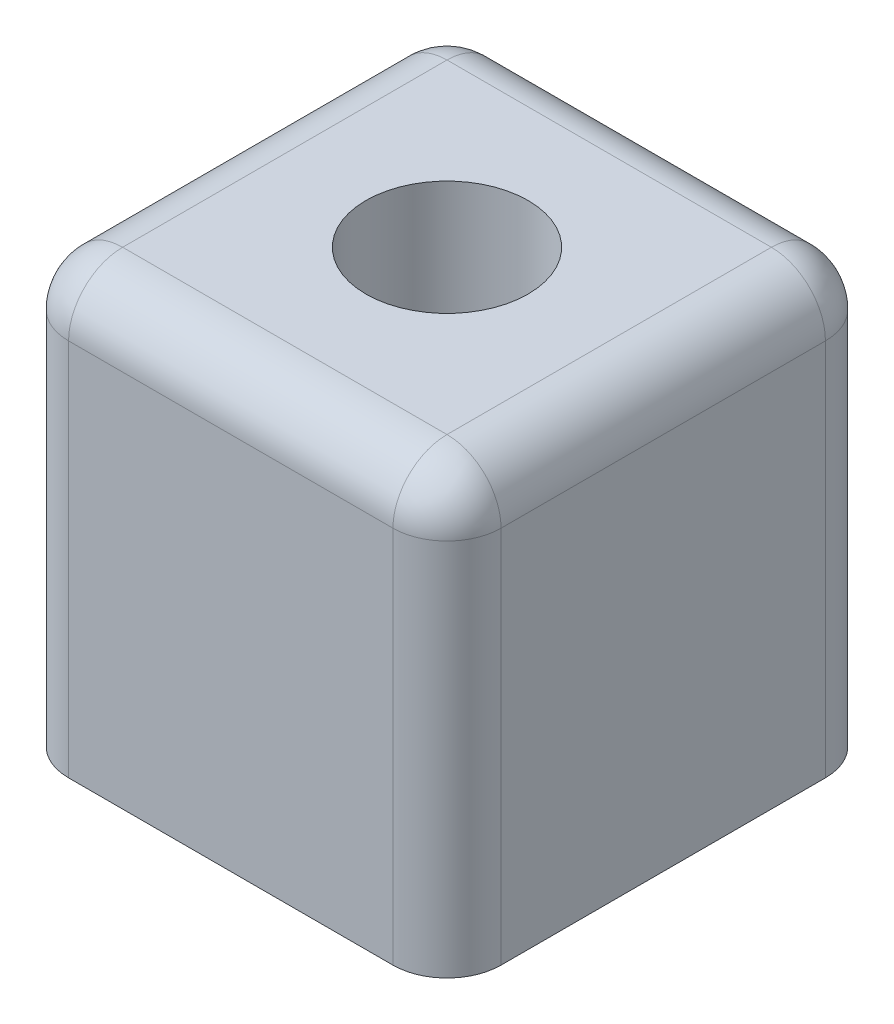
ISO-10303-21;
HEADER;
FILE_DESCRIPTION(('STEP AP214'),'2;1');
FILE_NAME('part.step','',(''),(''),'','','');
FILE_SCHEMA(('AUTOMOTIVE_DESIGN { 1 0 10303 214 1 1 1 1 }'));
ENDSEC;
DATA;
#1=APPLICATION_CONTEXT('core data for automotive mechanical design processes');
#2=APPLICATION_PROTOCOL_DEFINITION('international standard','automotive_design',2000,#1);
#3=PRODUCT_CONTEXT('',#1,'mechanical');
#4=PRODUCT('Part','Part','',(#3));
#5=PRODUCT_RELATED_PRODUCT_CATEGORY('part','',(#4));
#6=PRODUCT_DEFINITION_FORMATION('','',#4);
#7=PRODUCT_DEFINITION_CONTEXT('part definition',#1,'design');
#8=PRODUCT_DEFINITION('design','',#6,#7);
#9=PRODUCT_DEFINITION_SHAPE('','',#8);
#10=(LENGTH_UNIT() NAMED_UNIT(*) SI_UNIT(.MILLI.,.METRE.));
#11=(NAMED_UNIT(*) PLANE_ANGLE_UNIT() SI_UNIT($,.RADIAN.));
#12=(NAMED_UNIT(*) SI_UNIT($,.STERADIAN.) SOLID_ANGLE_UNIT());
#13=UNCERTAINTY_MEASURE_WITH_UNIT(LENGTH_MEASURE(1.E-05),#10,'distance_accuracy_value','');
#14=(GEOMETRIC_REPRESENTATION_CONTEXT(3) GLOBAL_UNCERTAINTY_ASSIGNED_CONTEXT((#13)) GLOBAL_UNIT_ASSIGNED_CONTEXT((#10,
#11,#12)) REPRESENTATION_CONTEXT('',''));
#15=CARTESIAN_POINT('',(0.,0.,0.));
#16=DIRECTION('',(0.,0.,1.));
#17=DIRECTION('',(1.,0.,0.));
#18=AXIS2_PLACEMENT_3D('',#15,#16,#17);
#19=CARTESIAN_POINT('',(0.,0.,80.));
#20=DIRECTION('',(1.,0.,0.));
#21=DIRECTION('',(0.,0.,-1.));
#22=AXIS2_PLACEMENT_3D('',#19,#20,#21);
#23=PLANE('',#22);
#24=DIRECTION('',(0.,0.,-1.));
#25=VECTOR('',#24,1.);
#26=CARTESIAN_POINT('',(0.,70.,80.));
#27=LINE('',#26,#25);
#28=CARTESIAN_POINT('',(0.,70.,70.));
#29=VERTEX_POINT('',#28);
#30=CARTESIAN_POINT('',(0.,70.,9.99999999999999));
#31=VERTEX_POINT('',#30);
#32=EDGE_CURVE('E309',#29,#31,#27,.T.);
#33=ORIENTED_EDGE('',*,*,#32,.T.);
#34=DIRECTION('',(0.,-1.,0.));
#35=VECTOR('',#34,1.);
#36=CARTESIAN_POINT('',(0.,0.,9.99999999999999));
#37=LINE('',#36,#35);
#38=CARTESIAN_POINT('',(0.,0.,9.99999999999999));
#39=VERTEX_POINT('',#38);
#40=EDGE_CURVE('E311',#31,#39,#37,.T.);
#41=ORIENTED_EDGE('',*,*,#40,.T.);
#42=DIRECTION('',(0.,0.,-1.));
#43=VECTOR('',#42,1.);
#44=CARTESIAN_POINT('',(0.,0.,80.));
#45=LINE('',#44,#43);
#46=CARTESIAN_POINT('',(0.,0.,70.));
#47=VERTEX_POINT('',#46);
#48=EDGE_CURVE('E282',#47,#39,#45,.T.);
#49=ORIENTED_EDGE('',*,*,#48,.F.);
#50=DIRECTION('',(0.,-1.,0.));
#51=VECTOR('',#50,1.);
#52=CARTESIAN_POINT('',(0.,0.,70.));
#53=LINE('',#52,#51);
#54=EDGE_CURVE('E307',#47,#29,#53,.F.);
#55=ORIENTED_EDGE('',*,*,#54,.T.);
#56=EDGE_LOOP('',(#33,#41,#49,#55));
#57=FACE_BOUND('',#56,.T.);
#58=ADVANCED_FACE('F37',(#57),#23,.F.);
#59=CARTESIAN_POINT('',(0.,0.,80.));
#60=DIRECTION('',(0.,1.,0.));
#61=DIRECTION('',(0.,0.,1.));
#62=AXIS2_PLACEMENT_3D('',#59,#60,#61);
#63=PLANE('',#62);
#64=DIRECTION('',(0.,0.,-1.));
#65=VECTOR('',#64,1.);
#66=CARTESIAN_POINT('',(3.,0.,80.));
#67=LINE('',#66,#65);
#68=CARTESIAN_POINT('',(3.,0.,70.));
#69=VERTEX_POINT('',#68);
#70=CARTESIAN_POINT('',(3.,0.,9.99999999999999));
#71=VERTEX_POINT('',#70);
#72=EDGE_CURVE('E196',#69,#71,#67,.T.);
#73=ORIENTED_EDGE('',*,*,#72,.F.);
#74=CARTESIAN_POINT('',(10.,0.,70.));
#75=DIRECTION('',(0.,1.,0.));
#76=DIRECTION('',(0.,0.,1.));
#77=AXIS2_PLACEMENT_3D('',#74,#75,#76);
#78=CIRCLE('',#77,7.);
#79=CARTESIAN_POINT('',(10.,0.,77.));
#80=VERTEX_POINT('',#79);
#81=EDGE_CURVE('E219',#80,#69,#78,.F.);
#82=ORIENTED_EDGE('',*,*,#81,.F.);
#83=DIRECTION('',(1.,0.,0.));
#84=VECTOR('',#83,1.);
#85=CARTESIAN_POINT('',(0.,0.,77.));
#86=LINE('',#85,#84);
#87=CARTESIAN_POINT('',(70.,0.,77.));
#88=VERTEX_POINT('',#87);
#89=EDGE_CURVE('E54',#80,#88,#86,.T.);
#90=ORIENTED_EDGE('',*,*,#89,.T.);
#91=CARTESIAN_POINT('',(70.,0.,70.));
#92=DIRECTION('',(0.,1.,0.));
#93=DIRECTION('',(0.,0.,1.));
#94=AXIS2_PLACEMENT_3D('',#91,#92,#93);
#95=CIRCLE('',#94,7.);
#96=CARTESIAN_POINT('',(77.,0.,70.));
#97=VERTEX_POINT('',#96);
#98=EDGE_CURVE('E261',#97,#88,#95,.F.);
#99=ORIENTED_EDGE('',*,*,#98,.F.);
#100=DIRECTION('',(0.,0.,-1.));
#101=VECTOR('',#100,1.);
#102=CARTESIAN_POINT('',(77.,0.,80.));
#103=LINE('',#102,#101);
#104=CARTESIAN_POINT('',(77.,0.,9.99999999999999));
#105=VERTEX_POINT('',#104);
#106=EDGE_CURVE('E251',#97,#105,#103,.T.);
#107=ORIENTED_EDGE('',*,*,#106,.T.);
#108=CARTESIAN_POINT('',(70.,0.,9.99999999999999));
#109=DIRECTION('',(0.,1.,0.));
#110=DIRECTION('',(0.,0.,1.));
#111=AXIS2_PLACEMENT_3D('',#108,#109,#110);
#112=CIRCLE('',#111,7.);
#113=CARTESIAN_POINT('',(70.,0.,3.));
#114=VERTEX_POINT('',#113);
#115=EDGE_CURVE('E255',#114,#105,#112,.F.);
#116=ORIENTED_EDGE('',*,*,#115,.F.);
#117=DIRECTION('',(1.,0.,0.));
#118=VECTOR('',#117,1.);
#119=CARTESIAN_POINT('',(0.,0.,3.));
#120=LINE('',#119,#118);
#121=CARTESIAN_POINT('',(10.,0.,3.));
#122=VERTEX_POINT('',#121);
#123=EDGE_CURVE('E256',#122,#114,#120,.T.);
#124=ORIENTED_EDGE('',*,*,#123,.F.);
#125=CARTESIAN_POINT('',(10.,0.,9.99999999999999));
#126=DIRECTION('',(0.,1.,0.));
#127=DIRECTION('',(0.,0.,1.));
#128=AXIS2_PLACEMENT_3D('',#125,#126,#127);
#129=CIRCLE('',#128,7.);
#130=EDGE_CURVE('E252',#71,#122,#129,.F.);
#131=ORIENTED_EDGE('',*,*,#130,.F.);
#132=EDGE_LOOP('',(#73,#82,#90,#99,#107,#116,#124,#131));
#133=FACE_BOUND('',#132,.T.);
#134=ORIENTED_EDGE('',*,*,#48,.T.);
#135=CARTESIAN_POINT('',(10.,0.,9.99999999999999));
#136=DIRECTION('',(0.,1.,0.));
#137=DIRECTION('',(0.,0.,1.));
#138=AXIS2_PLACEMENT_3D('',#135,#136,#137);
#139=CIRCLE('',#138,10.);
#140=CARTESIAN_POINT('',(10.,0.,0.));
#141=VERTEX_POINT('',#140);
#142=EDGE_CURVE('E11',#39,#141,#139,.F.);
#143=ORIENTED_EDGE('',*,*,#142,.T.);
#144=DIRECTION('',(1.,0.,0.));
#145=VECTOR('',#144,1.);
#146=CARTESIAN_POINT('',(0.,0.,0.));
#147=LINE('',#146,#145);
#148=CARTESIAN_POINT('',(70.,0.,0.));
#149=VERTEX_POINT('',#148);
#150=EDGE_CURVE('E270',#141,#149,#147,.T.);
#151=ORIENTED_EDGE('',*,*,#150,.T.);
#152=CARTESIAN_POINT('',(70.,0.,9.99999999999999));
#153=DIRECTION('',(0.,1.,0.));
#154=DIRECTION('',(0.,0.,1.));
#155=AXIS2_PLACEMENT_3D('',#152,#153,#154);
#156=CIRCLE('',#155,10.);
#157=CARTESIAN_POINT('',(80.,0.,9.99999999999999));
#158=VERTEX_POINT('',#157);
#159=EDGE_CURVE('E46',#149,#158,#156,.F.);
#160=ORIENTED_EDGE('',*,*,#159,.T.);
#161=DIRECTION('',(0.,0.,-1.));
#162=VECTOR('',#161,1.);
#163=CARTESIAN_POINT('',(80.,0.,80.));
#164=LINE('',#163,#162);
#165=CARTESIAN_POINT('',(80.,0.,70.));
#166=VERTEX_POINT('',#165);
#167=EDGE_CURVE('E277',#166,#158,#164,.T.);
#168=ORIENTED_EDGE('',*,*,#167,.F.);
#169=CARTESIAN_POINT('',(70.,0.,70.));
#170=DIRECTION('',(0.,1.,0.));
#171=DIRECTION('',(0.,0.,1.));
#172=AXIS2_PLACEMENT_3D('',#169,#170,#171);
#173=CIRCLE('',#172,10.);
#174=CARTESIAN_POINT('',(70.,0.,80.));
#175=VERTEX_POINT('',#174);
#176=EDGE_CURVE('E320',#166,#175,#173,.F.);
#177=ORIENTED_EDGE('',*,*,#176,.T.);
#178=DIRECTION('',(1.,0.,0.));
#179=VECTOR('',#178,1.);
#180=CARTESIAN_POINT('',(0.,0.,80.));
#181=LINE('',#180,#179);
#182=CARTESIAN_POINT('',(10.,0.,80.));
#183=VERTEX_POINT('',#182);
#184=EDGE_CURVE('E274',#183,#175,#181,.T.);
#185=ORIENTED_EDGE('',*,*,#184,.F.);
#186=CARTESIAN_POINT('',(10.,0.,70.));
#187=DIRECTION('',(0.,1.,0.));
#188=DIRECTION('',(0.,0.,1.));
#189=AXIS2_PLACEMENT_3D('',#186,#187,#188);
#190=CIRCLE('',#189,10.);
#191=EDGE_CURVE('E318',#183,#47,#190,.F.);
#192=ORIENTED_EDGE('',*,*,#191,.T.);
#193=EDGE_LOOP('',(#134,#143,#151,#160,#168,#177,#185,#192));
#194=FACE_BOUND('',#193,.T.);
#195=ADVANCED_FACE('F385',(#133,#194),#63,.F.);
#196=CARTESIAN_POINT('',(80.,0.,80.));
#197=DIRECTION('',(-1.,0.,0.));
#198=DIRECTION('',(0.,0.,1.));
#199=AXIS2_PLACEMENT_3D('',#196,#197,#198);
#200=PLANE('',#199);
#201=ORIENTED_EDGE('',*,*,#167,.T.);
#202=DIRECTION('',(0.,1.,0.));
#203=VECTOR('',#202,1.);
#204=CARTESIAN_POINT('',(80.,80.,9.99999999999999));
#205=LINE('',#204,#203);
#206=CARTESIAN_POINT('',(80.,70.,9.99999999999999));
#207=VERTEX_POINT('',#206);
#208=EDGE_CURVE('E299',#158,#207,#205,.T.);
#209=ORIENTED_EDGE('',*,*,#208,.T.);
#210=DIRECTION('',(0.,0.,-1.));
#211=VECTOR('',#210,1.);
#212=CARTESIAN_POINT('',(80.,70.,80.));
#213=LINE('',#212,#211);
#214=CARTESIAN_POINT('',(80.,70.,70.));
#215=VERTEX_POINT('',#214);
#216=EDGE_CURVE('E296',#207,#215,#213,.F.);
#217=ORIENTED_EDGE('',*,*,#216,.T.);
#218=DIRECTION('',(0.,1.,0.));
#219=VECTOR('',#218,1.);
#220=CARTESIAN_POINT('',(80.,0.,70.));
#221=LINE('',#220,#219);
#222=EDGE_CURVE('E294',#215,#166,#221,.F.);
#223=ORIENTED_EDGE('',*,*,#222,.T.);
#224=EDGE_LOOP('',(#201,#209,#217,#223));
#225=FACE_BOUND('',#224,.T.);
#226=ADVANCED_FACE('F404',(#225),#200,.F.);
#227=CARTESIAN_POINT('',(0.,80.,80.));
#228=DIRECTION('',(0.,-1.,0.));
#229=DIRECTION('',(0.,0.,-1.));
#230=AXIS2_PLACEMENT_3D('',#227,#228,#229);
#231=PLANE('',#230);
#232=DIRECTION('',(-1.,0.,0.));
#233=VECTOR('',#232,1.);
#234=CARTESIAN_POINT('',(0.,80.,70.));
#235=LINE('',#234,#233);
#236=CARTESIAN_POINT('',(10.,80.,70.));
#237=VERTEX_POINT('',#236);
#238=CARTESIAN_POINT('',(70.,80.,70.));
#239=VERTEX_POINT('',#238);
#240=EDGE_CURVE('E289',#237,#239,#235,.F.);
#241=ORIENTED_EDGE('',*,*,#240,.T.);
#242=DIRECTION('',(0.,0.,-1.));
#243=VECTOR('',#242,1.);
#244=CARTESIAN_POINT('',(70.,80.,80.));
#245=LINE('',#244,#243);
#246=CARTESIAN_POINT('',(70.,80.,9.99999999999999));
#247=VERTEX_POINT('',#246);
#248=EDGE_CURVE('E291',#239,#247,#245,.T.);
#249=ORIENTED_EDGE('',*,*,#248,.T.);
#250=DIRECTION('',(-1.,0.,0.));
#251=VECTOR('',#250,1.);
#252=CARTESIAN_POINT('',(0.,80.,9.99999999999999));
#253=LINE('',#252,#251);
#254=CARTESIAN_POINT('',(10.,80.,9.99999999999999));
#255=VERTEX_POINT('',#254);
#256=EDGE_CURVE('E285',#247,#255,#253,.T.);
#257=ORIENTED_EDGE('',*,*,#256,.T.);
#258=DIRECTION('',(0.,0.,-1.));
#259=VECTOR('',#258,1.);
#260=CARTESIAN_POINT('',(10.,80.,80.));
#261=LINE('',#260,#259);
#262=EDGE_CURVE('E287',#255,#237,#261,.F.);
#263=ORIENTED_EDGE('',*,*,#262,.T.);
#264=EDGE_LOOP('',(#241,#249,#257,#263));
#265=FACE_BOUND('',#264,.T.);
#266=CARTESIAN_POINT('',(40.,80.,40.));
#267=DIRECTION('',(0.,1.,0.));
#268=DIRECTION('',(0.,0.,1.));
#269=AXIS2_PLACEMENT_3D('',#266,#267,#268);
#270=CIRCLE('',#269,15.);
#271=CARTESIAN_POINT('',(40.,80.,55.));
#272=VERTEX_POINT('',#271);
#273=EDGE_CURVE('E271',#272,#272,#270,.T.);
#274=ORIENTED_EDGE('',*,*,#273,.F.);
#275=EDGE_LOOP('',(#274));
#276=FACE_BOUND('',#275,.T.);
#277=ADVANCED_FACE('F368',(#265,#276),#231,.F.);
#278=CARTESIAN_POINT('',(0.,0.,80.));
#279=DIRECTION('',(0.,0.,-1.));
#280=DIRECTION('',(-1.,0.,0.));
#281=AXIS2_PLACEMENT_3D('',#278,#279,#280);
#282=PLANE('',#281);
#283=ORIENTED_EDGE('',*,*,#184,.T.);
#284=DIRECTION('',(0.,1.,0.));
#285=VECTOR('',#284,1.);
#286=CARTESIAN_POINT('',(70.,0.,80.));
#287=LINE('',#286,#285);
#288=CARTESIAN_POINT('',(70.,70.,80.));
#289=VERTEX_POINT('',#288);
#290=EDGE_CURVE('E305',#175,#289,#287,.T.);
#291=ORIENTED_EDGE('',*,*,#290,.T.);
#292=DIRECTION('',(-1.,0.,0.));
#293=VECTOR('',#292,1.);
#294=CARTESIAN_POINT('',(0.,70.,80.));
#295=LINE('',#294,#293);
#296=CARTESIAN_POINT('',(10.,70.,80.));
#297=VERTEX_POINT('',#296);
#298=EDGE_CURVE('E303',#289,#297,#295,.T.);
#299=ORIENTED_EDGE('',*,*,#298,.T.);
#300=DIRECTION('',(0.,-1.,0.));
#301=VECTOR('',#300,1.);
#302=CARTESIAN_POINT('',(10.,0.,80.));
#303=LINE('',#302,#301);
#304=EDGE_CURVE('E301',#297,#183,#303,.T.);
#305=ORIENTED_EDGE('',*,*,#304,.T.);
#306=EDGE_LOOP('',(#283,#291,#299,#305));
#307=FACE_BOUND('',#306,.T.);
#308=ADVANCED_FACE('F413',(#307),#282,.F.);
#309=CARTESIAN_POINT('',(0.,0.,0.));
#310=DIRECTION('',(0.,0.,-1.));
#311=DIRECTION('',(-1.,0.,0.));
#312=AXIS2_PLACEMENT_3D('',#309,#310,#311);
#313=PLANE('',#312);
#314=ORIENTED_EDGE('',*,*,#150,.F.);
#315=DIRECTION('',(0.,-1.,0.));
#316=VECTOR('',#315,1.);
#317=CARTESIAN_POINT('',(10.,80.,0.));
#318=LINE('',#317,#316);
#319=CARTESIAN_POINT('',(10.,70.,0.));
#320=VERTEX_POINT('',#319);
#321=EDGE_CURVE('E62',#141,#320,#318,.F.);
#322=ORIENTED_EDGE('',*,*,#321,.T.);
#323=DIRECTION('',(-1.,0.,0.));
#324=VECTOR('',#323,1.);
#325=CARTESIAN_POINT('',(80.,70.,0.));
#326=LINE('',#325,#324);
#327=CARTESIAN_POINT('',(70.,70.,0.));
#328=VERTEX_POINT('',#327);
#329=EDGE_CURVE('E315',#320,#328,#326,.F.);
#330=ORIENTED_EDGE('',*,*,#329,.T.);
#331=DIRECTION('',(0.,1.,0.));
#332=VECTOR('',#331,1.);
#333=CARTESIAN_POINT('',(70.,0.,0.));
#334=LINE('',#333,#332);
#335=EDGE_CURVE('E313',#328,#149,#334,.F.);
#336=ORIENTED_EDGE('',*,*,#335,.T.);
#337=EDGE_LOOP('',(#314,#322,#330,#336));
#338=FACE_BOUND('',#337,.T.);
#339=ADVANCED_FACE('F387',(#338),#313,.T.);
#340=CARTESIAN_POINT('',(40.,30.,40.));
#341=DIRECTION('',(0.,1.,0.));
#342=DIRECTION('',(0.,0.,1.));
#343=AXIS2_PLACEMENT_3D('',#340,#341,#342);
#344=CYLINDRICAL_SURFACE('',#343,15.);
#345=CARTESIAN_POINT('',(40.,30.,40.));
#346=DIRECTION('',(0.,1.,0.));
#347=DIRECTION('',(0.,0.,1.));
#348=AXIS2_PLACEMENT_3D('',#345,#346,#347);
#349=CIRCLE('',#348,15.);
#350=CARTESIAN_POINT('',(40.,30.,55.));
#351=VERTEX_POINT('',#350);
#352=EDGE_CURVE('E267',#351,#351,#349,.T.);
#353=ORIENTED_EDGE('',*,*,#352,.F.);
#354=EDGE_LOOP('',(#353));
#355=FACE_BOUND('',#354,.T.);
#356=ORIENTED_EDGE('',*,*,#273,.T.);
#357=EDGE_LOOP('',(#356));
#358=FACE_BOUND('',#357,.T.);
#359=ADVANCED_FACE('F421',(#355,#358),#344,.F.);
#360=CARTESIAN_POINT('',(40.,30.,40.));
#361=DIRECTION('',(0.,1.,0.));
#362=DIRECTION('',(0.,0.,1.));
#363=AXIS2_PLACEMENT_3D('',#360,#361,#362);
#364=PLANE('',#363);
#365=ORIENTED_EDGE('',*,*,#352,.T.);
#366=EDGE_LOOP('',(#365));
#367=FACE_BOUND('',#366,.T.);
#368=ADVANCED_FACE('F416',(#367),#364,.T.);
#369=CARTESIAN_POINT('',(10.,0.,70.));
#370=DIRECTION('',(0.,-1.,0.));
#371=DIRECTION('',(0.,0.,-1.));
#372=AXIS2_PLACEMENT_3D('',#369,#370,#371);
#373=CYLINDRICAL_SURFACE('',#372,10.);
#374=ORIENTED_EDGE('',*,*,#191,.F.);
#375=ORIENTED_EDGE('',*,*,#304,.F.);
#376=CARTESIAN_POINT('',(10.,70.,70.));
#377=DIRECTION('',(0.,1.,0.));
#378=DIRECTION('',(0.,0.,1.));
#379=AXIS2_PLACEMENT_3D('',#376,#377,#378);
#380=CIRCLE('',#379,10.);
#381=EDGE_CURVE('E41',#29,#297,#380,.T.);
#382=ORIENTED_EDGE('',*,*,#381,.F.);
#383=ORIENTED_EDGE('',*,*,#54,.F.);
#384=EDGE_LOOP('',(#374,#375,#382,#383));
#385=FACE_BOUND('',#384,.T.);
#386=ADVANCED_FACE('F39',(#385),#373,.T.);
#387=CARTESIAN_POINT('',(10.,70.,80.));
#388=DIRECTION('',(0.,0.,-1.));
#389=DIRECTION('',(-1.,0.,0.));
#390=AXIS2_PLACEMENT_3D('',#387,#388,#389);
#391=CYLINDRICAL_SURFACE('',#390,10.);
#392=CARTESIAN_POINT('',(10.,70.,9.99999999999999));
#393=DIRECTION('',(0.,0.,-1.));
#394=DIRECTION('',(-1.,0.,0.));
#395=AXIS2_PLACEMENT_3D('',#392,#393,#394);
#396=CIRCLE('',#395,10.);
#397=EDGE_CURVE('E347',#31,#255,#396,.T.);
#398=ORIENTED_EDGE('',*,*,#397,.F.);
#399=ORIENTED_EDGE('',*,*,#32,.F.);
#400=CARTESIAN_POINT('',(10.,70.,70.));
#401=DIRECTION('',(0.,0.,1.));
#402=DIRECTION('',(1.,0.,0.));
#403=AXIS2_PLACEMENT_3D('',#400,#401,#402);
#404=CIRCLE('',#403,10.);
#405=EDGE_CURVE('E349',#237,#29,#404,.T.);
#406=ORIENTED_EDGE('',*,*,#405,.F.);
#407=ORIENTED_EDGE('',*,*,#262,.F.);
#408=EDGE_LOOP('',(#398,#399,#406,#407));
#409=FACE_BOUND('',#408,.T.);
#410=ADVANCED_FACE('F376',(#409),#391,.T.);
#411=CARTESIAN_POINT('',(10.,0.,9.99999999999999));
#412=DIRECTION('',(0.,1.,0.));
#413=DIRECTION('',(0.,0.,1.));
#414=AXIS2_PLACEMENT_3D('',#411,#412,#413);
#415=CYLINDRICAL_SURFACE('',#414,10.);
#416=ORIENTED_EDGE('',*,*,#142,.F.);
#417=ORIENTED_EDGE('',*,*,#40,.F.);
#418=CARTESIAN_POINT('',(10.,70.,10.));
#419=DIRECTION('',(0.,1.,0.));
#420=DIRECTION('',(0.,0.,1.));
#421=AXIS2_PLACEMENT_3D('',#418,#419,#420);
#422=CIRCLE('',#421,10.);
#423=EDGE_CURVE('E344',#320,#31,#422,.T.);
#424=ORIENTED_EDGE('',*,*,#423,.F.);
#425=ORIENTED_EDGE('',*,*,#321,.F.);
#426=EDGE_LOOP('',(#416,#417,#424,#425));
#427=FACE_BOUND('',#426,.T.);
#428=ADVANCED_FACE('F382',(#427),#415,.T.);
#429=CARTESIAN_POINT('',(10.,70.,70.));
#430=DIRECTION('',(-1.,0.,0.));
#431=DIRECTION('',(0.,0.,1.));
#432=AXIS2_PLACEMENT_3D('',#429,#430,#431);
#433=SPHERICAL_SURFACE('',#432,10.);
#434=ORIENTED_EDGE('',*,*,#405,.T.);
#435=ORIENTED_EDGE('',*,*,#381,.T.);
#436=CARTESIAN_POINT('',(10.,70.,70.));
#437=DIRECTION('',(-1.,0.,0.));
#438=DIRECTION('',(0.,0.,1.));
#439=AXIS2_PLACEMENT_3D('',#436,#437,#438);
#440=CIRCLE('',#439,10.);
#441=EDGE_CURVE('E341',#237,#297,#440,.F.);
#442=ORIENTED_EDGE('',*,*,#441,.F.);
#443=EDGE_LOOP('',(#434,#435,#442));
#444=FACE_BOUND('',#443,.T.);
#445=ADVANCED_FACE('F356',(#444),#433,.T.);
#446=CARTESIAN_POINT('',(10.,70.,10.));
#447=DIRECTION('',(-1.,0.,0.));
#448=DIRECTION('',(0.,0.,1.));
#449=AXIS2_PLACEMENT_3D('',#446,#447,#448);
#450=SPHERICAL_SURFACE('',#449,10.);
#451=ORIENTED_EDGE('',*,*,#423,.T.);
#452=ORIENTED_EDGE('',*,*,#397,.T.);
#453=CARTESIAN_POINT('',(10.,70.,9.99999999999999));
#454=DIRECTION('',(-1.,0.,0.));
#455=DIRECTION('',(0.,0.,1.));
#456=AXIS2_PLACEMENT_3D('',#453,#454,#455);
#457=CIRCLE('',#456,10.);
#458=EDGE_CURVE('E338',#320,#255,#457,.F.);
#459=ORIENTED_EDGE('',*,*,#458,.F.);
#460=EDGE_LOOP('',(#451,#452,#459));
#461=FACE_BOUND('',#460,.T.);
#462=ADVANCED_FACE('F451',(#461),#450,.T.);
#463=CARTESIAN_POINT('',(70.,0.,70.));
#464=DIRECTION('',(0.,1.,0.));
#465=DIRECTION('',(0.,0.,1.));
#466=AXIS2_PLACEMENT_3D('',#463,#464,#465);
#467=CYLINDRICAL_SURFACE('',#466,10.);
#468=ORIENTED_EDGE('',*,*,#176,.F.);
#469=ORIENTED_EDGE('',*,*,#222,.F.);
#470=CARTESIAN_POINT('',(70.,70.,70.));
#471=DIRECTION('',(0.,1.,0.));
#472=DIRECTION('',(0.,0.,1.));
#473=AXIS2_PLACEMENT_3D('',#470,#471,#472);
#474=CIRCLE('',#473,10.);
#475=EDGE_CURVE('E335',#289,#215,#474,.T.);
#476=ORIENTED_EDGE('',*,*,#475,.F.);
#477=ORIENTED_EDGE('',*,*,#290,.F.);
#478=EDGE_LOOP('',(#468,#469,#476,#477));
#479=FACE_BOUND('',#478,.T.);
#480=ADVANCED_FACE('F411',(#479),#467,.T.);
#481=CARTESIAN_POINT('',(0.,70.,70.));
#482=DIRECTION('',(-1.,0.,0.));
#483=DIRECTION('',(0.,0.,1.));
#484=AXIS2_PLACEMENT_3D('',#481,#482,#483);
#485=CYLINDRICAL_SURFACE('',#484,10.);
#486=ORIENTED_EDGE('',*,*,#441,.T.);
#487=ORIENTED_EDGE('',*,*,#298,.F.);
#488=CARTESIAN_POINT('',(70.,70.,70.));
#489=DIRECTION('',(1.,0.,0.));
#490=DIRECTION('',(0.,0.,-1.));
#491=AXIS2_PLACEMENT_3D('',#488,#489,#490);
#492=CIRCLE('',#491,10.);
#493=EDGE_CURVE('E332',#239,#289,#492,.T.);
#494=ORIENTED_EDGE('',*,*,#493,.F.);
#495=ORIENTED_EDGE('',*,*,#240,.F.);
#496=EDGE_LOOP('',(#486,#487,#494,#495));
#497=FACE_BOUND('',#496,.T.);
#498=ADVANCED_FACE('F363',(#497),#485,.T.);
#499=CARTESIAN_POINT('',(0.,70.,9.99999999999999));
#500=DIRECTION('',(1.,0.,0.));
#501=DIRECTION('',(0.,0.,-1.));
#502=AXIS2_PLACEMENT_3D('',#499,#500,#501);
#503=CYLINDRICAL_SURFACE('',#502,10.);
#504=ORIENTED_EDGE('',*,*,#458,.T.);
#505=ORIENTED_EDGE('',*,*,#256,.F.);
#506=CARTESIAN_POINT('',(70.,70.,10.));
#507=DIRECTION('',(1.,0.,0.));
#508=DIRECTION('',(0.,0.,-1.));
#509=AXIS2_PLACEMENT_3D('',#506,#507,#508);
#510=CIRCLE('',#509,10.);
#511=EDGE_CURVE('E329',#328,#247,#510,.T.);
#512=ORIENTED_EDGE('',*,*,#511,.F.);
#513=ORIENTED_EDGE('',*,*,#329,.F.);
#514=EDGE_LOOP('',(#504,#505,#512,#513));
#515=FACE_BOUND('',#514,.T.);
#516=ADVANCED_FACE('F397',(#515),#503,.T.);
#517=CARTESIAN_POINT('',(70.,0.,9.99999999999999));
#518=DIRECTION('',(0.,-1.,0.));
#519=DIRECTION('',(0.,0.,-1.));
#520=AXIS2_PLACEMENT_3D('',#517,#518,#519);
#521=CYLINDRICAL_SURFACE('',#520,10.);
#522=ORIENTED_EDGE('',*,*,#159,.F.);
#523=ORIENTED_EDGE('',*,*,#335,.F.);
#524=CARTESIAN_POINT('',(70.,70.,9.99999999999999));
#525=DIRECTION('',(0.,1.,0.));
#526=DIRECTION('',(0.,0.,1.));
#527=AXIS2_PLACEMENT_3D('',#524,#525,#526);
#528=CIRCLE('',#527,10.);
#529=EDGE_CURVE('E326',#207,#328,#528,.T.);
#530=ORIENTED_EDGE('',*,*,#529,.F.);
#531=ORIENTED_EDGE('',*,*,#208,.F.);
#532=EDGE_LOOP('',(#522,#523,#530,#531));
#533=FACE_BOUND('',#532,.T.);
#534=ADVANCED_FACE('F393',(#533),#521,.T.);
#535=CARTESIAN_POINT('',(70.,70.,70.));
#536=DIRECTION('',(0.,0.,1.));
#537=DIRECTION('',(1.,0.,0.));
#538=AXIS2_PLACEMENT_3D('',#535,#536,#537);
#539=SPHERICAL_SURFACE('',#538,10.);
#540=ORIENTED_EDGE('',*,*,#493,.T.);
#541=ORIENTED_EDGE('',*,*,#475,.T.);
#542=CARTESIAN_POINT('',(70.,70.,70.));
#543=DIRECTION('',(0.,0.,1.));
#544=DIRECTION('',(1.,0.,0.));
#545=AXIS2_PLACEMENT_3D('',#542,#543,#544);
#546=CIRCLE('',#545,10.);
#547=EDGE_CURVE('E324',#239,#215,#546,.F.);
#548=ORIENTED_EDGE('',*,*,#547,.F.);
#549=EDGE_LOOP('',(#540,#541,#548));
#550=FACE_BOUND('',#549,.T.);
#551=ADVANCED_FACE('F439',(#550),#539,.T.);
#552=CARTESIAN_POINT('',(70.,70.,10.));
#553=DIRECTION('',(0.,0.,-1.));
#554=DIRECTION('',(-1.,0.,0.));
#555=AXIS2_PLACEMENT_3D('',#552,#553,#554);
#556=SPHERICAL_SURFACE('',#555,10.);
#557=ORIENTED_EDGE('',*,*,#529,.T.);
#558=ORIENTED_EDGE('',*,*,#511,.T.);
#559=CARTESIAN_POINT('',(70.,70.,9.99999999999999));
#560=DIRECTION('',(0.,0.,-1.));
#561=DIRECTION('',(-1.,0.,0.));
#562=AXIS2_PLACEMENT_3D('',#559,#560,#561);
#563=CIRCLE('',#562,10.);
#564=EDGE_CURVE('E254',#207,#247,#563,.F.);
#565=ORIENTED_EDGE('',*,*,#564,.F.);
#566=EDGE_LOOP('',(#557,#558,#565));
#567=FACE_BOUND('',#566,.T.);
#568=ADVANCED_FACE('F400',(#567),#556,.T.);
#569=CARTESIAN_POINT('',(70.,70.,80.));
#570=DIRECTION('',(0.,0.,-1.));
#571=DIRECTION('',(-1.,0.,0.));
#572=AXIS2_PLACEMENT_3D('',#569,#570,#571);
#573=CYLINDRICAL_SURFACE('',#572,10.);
#574=ORIENTED_EDGE('',*,*,#547,.T.);
#575=ORIENTED_EDGE('',*,*,#216,.F.);
#576=ORIENTED_EDGE('',*,*,#564,.T.);
#577=ORIENTED_EDGE('',*,*,#248,.F.);
#578=EDGE_LOOP('',(#574,#575,#576,#577));
#579=FACE_BOUND('',#578,.T.);
#580=ADVANCED_FACE('F402',(#579),#573,.T.);
#581=CARTESIAN_POINT('',(3.,0.,80.));
#582=DIRECTION('',(1.,0.,0.));
#583=DIRECTION('',(0.,0.,-1.));
#584=AXIS2_PLACEMENT_3D('',#581,#582,#583);
#585=PLANE('',#584);
#586=DIRECTION('',(0.,0.,-1.));
#587=VECTOR('',#586,1.);
#588=CARTESIAN_POINT('',(3.,70.,80.));
#589=LINE('',#588,#587);
#590=CARTESIAN_POINT('',(3.,70.,70.));
#591=VERTEX_POINT('',#590);
#592=CARTESIAN_POINT('',(3.,70.,9.99999999999999));
#593=VERTEX_POINT('',#592);
#594=EDGE_CURVE('E179',#591,#593,#589,.T.);
#595=ORIENTED_EDGE('',*,*,#594,.F.);
#596=DIRECTION('',(0.,1.,0.));
#597=VECTOR('',#596,1.);
#598=CARTESIAN_POINT('',(3.,0.,70.));
#599=LINE('',#598,#597);
#600=EDGE_CURVE('E191',#69,#591,#599,.T.);
#601=ORIENTED_EDGE('',*,*,#600,.F.);
#602=ORIENTED_EDGE('',*,*,#72,.T.);
#603=DIRECTION('',(0.,1.,0.));
#604=VECTOR('',#603,1.);
#605=CARTESIAN_POINT('',(3.,0.,9.99999999999999));
#606=LINE('',#605,#604);
#607=EDGE_CURVE('E190',#593,#71,#606,.F.);
#608=ORIENTED_EDGE('',*,*,#607,.F.);
#609=EDGE_LOOP('',(#595,#601,#602,#608));
#610=FACE_BOUND('',#609,.T.);
#611=ADVANCED_FACE('F194',(#610),#585,.T.);
#612=CARTESIAN_POINT('',(77.,0.,80.));
#613=DIRECTION('',(-1.,0.,0.));
#614=DIRECTION('',(0.,0.,1.));
#615=AXIS2_PLACEMENT_3D('',#612,#613,#614);
#616=PLANE('',#615);
#617=ORIENTED_EDGE('',*,*,#106,.F.);
#618=DIRECTION('',(0.,1.,0.));
#619=VECTOR('',#618,1.);
#620=CARTESIAN_POINT('',(77.,0.,70.));
#621=LINE('',#620,#619);
#622=CARTESIAN_POINT('',(77.,70.,70.));
#623=VERTEX_POINT('',#622);
#624=EDGE_CURVE('E239',#623,#97,#621,.F.);
#625=ORIENTED_EDGE('',*,*,#624,.F.);
#626=DIRECTION('',(0.,0.,1.));
#627=VECTOR('',#626,1.);
#628=CARTESIAN_POINT('',(77.,70.,80.));
#629=LINE('',#628,#627);
#630=CARTESIAN_POINT('',(77.,70.,9.99999999999999));
#631=VERTEX_POINT('',#630);
#632=EDGE_CURVE('E236',#631,#623,#629,.T.);
#633=ORIENTED_EDGE('',*,*,#632,.F.);
#634=DIRECTION('',(0.,1.,0.));
#635=VECTOR('',#634,1.);
#636=CARTESIAN_POINT('',(77.,0.,9.99999999999999));
#637=LINE('',#636,#635);
#638=EDGE_CURVE('E233',#105,#631,#637,.T.);
#639=ORIENTED_EDGE('',*,*,#638,.F.);
#640=EDGE_LOOP('',(#617,#625,#633,#639));
#641=FACE_BOUND('',#640,.T.);
#642=ADVANCED_FACE('F505',(#641),#616,.T.);
#643=CARTESIAN_POINT('',(0.,77.,80.));
#644=DIRECTION('',(0.,-1.,0.));
#645=DIRECTION('',(0.,0.,-1.));
#646=AXIS2_PLACEMENT_3D('',#643,#644,#645);
#647=PLANE('',#646);
#648=DIRECTION('',(1.,0.,0.));
#649=VECTOR('',#648,1.);
#650=CARTESIAN_POINT('',(0.,77.,70.));
#651=LINE('',#650,#649);
#652=CARTESIAN_POINT('',(10.,77.,70.));
#653=VERTEX_POINT('',#652);
#654=CARTESIAN_POINT('',(70.,77.,70.));
#655=VERTEX_POINT('',#654);
#656=EDGE_CURVE('E855',#653,#655,#651,.T.);
#657=ORIENTED_EDGE('',*,*,#656,.F.);
#658=DIRECTION('',(0.,0.,-1.));
#659=VECTOR('',#658,1.);
#660=CARTESIAN_POINT('',(10.,77.,80.));
#661=LINE('',#660,#659);
#662=CARTESIAN_POINT('',(10.,77.,9.99999999999999));
#663=VERTEX_POINT('',#662);
#664=EDGE_CURVE('E857',#663,#653,#661,.F.);
#665=ORIENTED_EDGE('',*,*,#664,.F.);
#666=DIRECTION('',(1.,0.,0.));
#667=VECTOR('',#666,1.);
#668=CARTESIAN_POINT('',(0.,77.,9.99999999999999));
#669=LINE('',#668,#667);
#670=CARTESIAN_POINT('',(70.,77.,9.99999999999999));
#671=VERTEX_POINT('',#670);
#672=EDGE_CURVE('E250',#671,#663,#669,.F.);
#673=ORIENTED_EDGE('',*,*,#672,.F.);
#674=DIRECTION('',(0.,0.,-1.));
#675=VECTOR('',#674,1.);
#676=CARTESIAN_POINT('',(70.,77.,80.));
#677=LINE('',#676,#675);
#678=EDGE_CURVE('E241',#655,#671,#677,.T.);
#679=ORIENTED_EDGE('',*,*,#678,.F.);
#680=EDGE_LOOP('',(#657,#665,#673,#679));
#681=FACE_BOUND('',#680,.T.);
#682=CARTESIAN_POINT('',(40.,77.,40.));
#683=DIRECTION('',(0.,-1.,0.));
#684=DIRECTION('',(0.,0.,-1.));
#685=AXIS2_PLACEMENT_3D('',#682,#683,#684);
#686=CIRCLE('',#685,18.);
#687=CARTESIAN_POINT('',(40.,77.,22.));
#688=VERTEX_POINT('',#687);
#689=EDGE_CURVE('E862',#688,#688,#686,.F.);
#690=ORIENTED_EDGE('',*,*,#689,.T.);
#691=EDGE_LOOP('',(#690));
#692=FACE_BOUND('',#691,.T.);
#693=ADVANCED_FACE('F514',(#681,#692),#647,.T.);
#694=CARTESIAN_POINT('',(0.,0.,77.));
#695=DIRECTION('',(0.,0.,-1.));
#696=DIRECTION('',(-1.,0.,0.));
#697=AXIS2_PLACEMENT_3D('',#694,#695,#696);
#698=PLANE('',#697);
#699=ORIENTED_EDGE('',*,*,#89,.F.);
#700=DIRECTION('',(0.,1.,0.));
#701=VECTOR('',#700,1.);
#702=CARTESIAN_POINT('',(10.,0.,77.));
#703=LINE('',#702,#701);
#704=CARTESIAN_POINT('',(10.,70.,77.));
#705=VERTEX_POINT('',#704);
#706=EDGE_CURVE('E235',#705,#80,#703,.F.);
#707=ORIENTED_EDGE('',*,*,#706,.F.);
#708=DIRECTION('',(-1.,0.,0.));
#709=VECTOR('',#708,1.);
#710=CARTESIAN_POINT('',(0.,70.,77.));
#711=LINE('',#710,#709);
#712=CARTESIAN_POINT('',(70.,70.,77.));
#713=VERTEX_POINT('',#712);
#714=EDGE_CURVE('E877',#713,#705,#711,.T.);
#715=ORIENTED_EDGE('',*,*,#714,.F.);
#716=DIRECTION('',(0.,1.,0.));
#717=VECTOR('',#716,1.);
#718=CARTESIAN_POINT('',(70.,0.,77.));
#719=LINE('',#718,#717);
#720=EDGE_CURVE('E875',#88,#713,#719,.T.);
#721=ORIENTED_EDGE('',*,*,#720,.F.);
#722=EDGE_LOOP('',(#699,#707,#715,#721));
#723=FACE_BOUND('',#722,.T.);
#724=ADVANCED_FACE('F523',(#723),#698,.T.);
#725=CARTESIAN_POINT('',(0.,0.,3.));
#726=DIRECTION('',(0.,0.,-1.));
#727=DIRECTION('',(-1.,0.,0.));
#728=AXIS2_PLACEMENT_3D('',#725,#726,#727);
#729=PLANE('',#728);
#730=ORIENTED_EDGE('',*,*,#123,.T.);
#731=DIRECTION('',(0.,1.,0.));
#732=VECTOR('',#731,1.);
#733=CARTESIAN_POINT('',(70.,0.,3.));
#734=LINE('',#733,#732);
#735=CARTESIAN_POINT('',(70.,70.,3.));
#736=VERTEX_POINT('',#735);
#737=EDGE_CURVE('E200',#736,#114,#734,.F.);
#738=ORIENTED_EDGE('',*,*,#737,.F.);
#739=DIRECTION('',(-1.,0.,0.));
#740=VECTOR('',#739,1.);
#741=CARTESIAN_POINT('',(0.,70.,3.));
#742=LINE('',#741,#740);
#743=CARTESIAN_POINT('',(10.,70.,3.));
#744=VERTEX_POINT('',#743);
#745=EDGE_CURVE('E220',#744,#736,#742,.F.);
#746=ORIENTED_EDGE('',*,*,#745,.F.);
#747=DIRECTION('',(0.,1.,0.));
#748=VECTOR('',#747,1.);
#749=CARTESIAN_POINT('',(10.,0.,3.));
#750=LINE('',#749,#748);
#751=EDGE_CURVE('E211',#122,#744,#750,.T.);
#752=ORIENTED_EDGE('',*,*,#751,.F.);
#753=EDGE_LOOP('',(#730,#738,#746,#752));
#754=FACE_BOUND('',#753,.T.);
#755=ADVANCED_FACE('F532',(#754),#729,.F.);
#756=CARTESIAN_POINT('',(40.,30.,40.));
#757=DIRECTION('',(0.,1.,0.));
#758=DIRECTION('',(0.,0.,1.));
#759=AXIS2_PLACEMENT_3D('',#756,#757,#758);
#760=CYLINDRICAL_SURFACE('',#759,18.);
#761=CARTESIAN_POINT('',(40.,27.,40.));
#762=DIRECTION('',(0.,1.,0.));
#763=DIRECTION('',(0.,0.,1.));
#764=AXIS2_PLACEMENT_3D('',#761,#762,#763);
#765=CIRCLE('',#764,18.);
#766=CARTESIAN_POINT('',(40.,27.,58.));
#767=VERTEX_POINT('',#766);
#768=EDGE_CURVE('E259',#767,#767,#765,.T.);
#769=ORIENTED_EDGE('',*,*,#768,.T.);
#770=EDGE_LOOP('',(#769));
#771=FACE_BOUND('',#770,.T.);
#772=ORIENTED_EDGE('',*,*,#689,.F.);
#773=EDGE_LOOP('',(#772));
#774=FACE_BOUND('',#773,.T.);
#775=ADVANCED_FACE('F540',(#771,#774),#760,.T.);
#776=CARTESIAN_POINT('',(40.,27.,40.));
#777=DIRECTION('',(0.,1.,0.));
#778=DIRECTION('',(0.,0.,1.));
#779=AXIS2_PLACEMENT_3D('',#776,#777,#778);
#780=PLANE('',#779);
#781=ORIENTED_EDGE('',*,*,#768,.F.);
#782=EDGE_LOOP('',(#781));
#783=FACE_BOUND('',#782,.T.);
#784=ADVANCED_FACE('F549',(#783),#780,.F.);
#785=CARTESIAN_POINT('',(10.,0.,70.));
#786=DIRECTION('',(0.,-1.,0.));
#787=DIRECTION('',(0.,0.,-1.));
#788=AXIS2_PLACEMENT_3D('',#785,#786,#787);
#789=CYLINDRICAL_SURFACE('',#788,7.);
#790=ORIENTED_EDGE('',*,*,#81,.T.);
#791=ORIENTED_EDGE('',*,*,#600,.T.);
#792=CARTESIAN_POINT('',(10.,70.,70.));
#793=DIRECTION('',(0.,-1.,0.));
#794=DIRECTION('',(0.,0.,-1.));
#795=AXIS2_PLACEMENT_3D('',#792,#793,#794);
#796=CIRCLE('',#795,7.);
#797=EDGE_CURVE('E864',#591,#705,#796,.F.);
#798=ORIENTED_EDGE('',*,*,#797,.T.);
#799=ORIENTED_EDGE('',*,*,#706,.T.);
#800=EDGE_LOOP('',(#790,#791,#798,#799));
#801=FACE_BOUND('',#800,.T.);
#802=ADVANCED_FACE('F558',(#801),#789,.F.);
#803=CARTESIAN_POINT('',(10.,70.,80.));
#804=DIRECTION('',(0.,0.,-1.));
#805=DIRECTION('',(-1.,0.,0.));
#806=AXIS2_PLACEMENT_3D('',#803,#804,#805);
#807=CYLINDRICAL_SURFACE('',#806,7.);
#808=CARTESIAN_POINT('',(10.,70.,10.));
#809=DIRECTION('',(0.,0.,1.));
#810=DIRECTION('',(1.,0.,0.));
#811=AXIS2_PLACEMENT_3D('',#808,#809,#810);
#812=CIRCLE('',#811,7.);
#813=EDGE_CURVE('E183',#593,#663,#812,.F.);
#814=ORIENTED_EDGE('',*,*,#813,.T.);
#815=ORIENTED_EDGE('',*,*,#664,.T.);
#816=CARTESIAN_POINT('',(10.,70.,70.));
#817=DIRECTION('',(0.,0.,1.));
#818=DIRECTION('',(0.,-1.,0.));
#819=AXIS2_PLACEMENT_3D('',#816,#817,#818);
#820=CIRCLE('',#819,7.);
#821=EDGE_CURVE('E186',#653,#591,#820,.T.);
#822=ORIENTED_EDGE('',*,*,#821,.T.);
#823=ORIENTED_EDGE('',*,*,#594,.T.);
#824=EDGE_LOOP('',(#814,#815,#822,#823));
#825=FACE_BOUND('',#824,.T.);
#826=ADVANCED_FACE('F181',(#825),#807,.F.);
#827=CARTESIAN_POINT('',(10.,0.,9.99999999999999));
#828=DIRECTION('',(0.,1.,0.));
#829=DIRECTION('',(0.,0.,1.));
#830=AXIS2_PLACEMENT_3D('',#827,#828,#829);
#831=CYLINDRICAL_SURFACE('',#830,7.);
#832=ORIENTED_EDGE('',*,*,#130,.T.);
#833=ORIENTED_EDGE('',*,*,#751,.T.);
#834=CARTESIAN_POINT('',(10.,70.,10.));
#835=DIRECTION('',(0.,1.,0.));
#836=DIRECTION('',(0.,0.,1.));
#837=AXIS2_PLACEMENT_3D('',#834,#835,#836);
#838=CIRCLE('',#837,7.);
#839=EDGE_CURVE('E205',#744,#593,#838,.T.);
#840=ORIENTED_EDGE('',*,*,#839,.T.);
#841=ORIENTED_EDGE('',*,*,#607,.T.);
#842=EDGE_LOOP('',(#832,#833,#840,#841));
#843=FACE_BOUND('',#842,.T.);
#844=ADVANCED_FACE('F209',(#843),#831,.F.);
#845=CARTESIAN_POINT('',(10.,70.,70.));
#846=DIRECTION('',(-1.,0.,0.));
#847=DIRECTION('',(0.,0.,1.));
#848=AXIS2_PLACEMENT_3D('',#845,#846,#847);
#849=SPHERICAL_SURFACE('',#848,7.);
#850=ORIENTED_EDGE('',*,*,#821,.F.);
#851=CARTESIAN_POINT('',(10.,70.,70.));
#852=DIRECTION('',(-1.,0.,0.));
#853=DIRECTION('',(0.,0.,1.));
#854=AXIS2_PLACEMENT_3D('',#851,#852,#853);
#855=CIRCLE('',#854,7.);
#856=EDGE_CURVE('E212',#653,#705,#855,.F.);
#857=ORIENTED_EDGE('',*,*,#856,.T.);
#858=ORIENTED_EDGE('',*,*,#797,.F.);
#859=EDGE_LOOP('',(#850,#857,#858));
#860=FACE_BOUND('',#859,.T.);
#861=ADVANCED_FACE('F582',(#860),#849,.F.);
#862=CARTESIAN_POINT('',(10.,70.,10.));
#863=DIRECTION('',(-1.,0.,0.));
#864=DIRECTION('',(0.,0.,1.));
#865=AXIS2_PLACEMENT_3D('',#862,#863,#864);
#866=SPHERICAL_SURFACE('',#865,7.);
#867=ORIENTED_EDGE('',*,*,#839,.F.);
#868=CARTESIAN_POINT('',(10.,70.,9.99999999999999));
#869=DIRECTION('',(1.,0.,0.));
#870=DIRECTION('',(0.,0.,-1.));
#871=AXIS2_PLACEMENT_3D('',#868,#869,#870);
#872=CIRCLE('',#871,7.);
#873=EDGE_CURVE('E207',#744,#663,#872,.T.);
#874=ORIENTED_EDGE('',*,*,#873,.T.);
#875=ORIENTED_EDGE('',*,*,#813,.F.);
#876=EDGE_LOOP('',(#867,#874,#875));
#877=FACE_BOUND('',#876,.T.);
#878=ADVANCED_FACE('F204',(#877),#866,.F.);
#879=CARTESIAN_POINT('',(70.,0.,70.));
#880=DIRECTION('',(0.,1.,0.));
#881=DIRECTION('',(0.,0.,1.));
#882=AXIS2_PLACEMENT_3D('',#879,#880,#881);
#883=CYLINDRICAL_SURFACE('',#882,7.);
#884=ORIENTED_EDGE('',*,*,#98,.T.);
#885=ORIENTED_EDGE('',*,*,#720,.T.);
#886=CARTESIAN_POINT('',(70.,70.,70.));
#887=DIRECTION('',(0.,-1.,0.));
#888=DIRECTION('',(0.,0.,-1.));
#889=AXIS2_PLACEMENT_3D('',#886,#887,#888);
#890=CIRCLE('',#889,7.);
#891=EDGE_CURVE('E224',#713,#623,#890,.F.);
#892=ORIENTED_EDGE('',*,*,#891,.T.);
#893=ORIENTED_EDGE('',*,*,#624,.T.);
#894=EDGE_LOOP('',(#884,#885,#892,#893));
#895=FACE_BOUND('',#894,.T.);
#896=ADVANCED_FACE('F598',(#895),#883,.F.);
#897=CARTESIAN_POINT('',(0.,70.,70.));
#898=DIRECTION('',(-1.,0.,0.));
#899=DIRECTION('',(0.,0.,1.));
#900=AXIS2_PLACEMENT_3D('',#897,#898,#899);
#901=CYLINDRICAL_SURFACE('',#900,7.);
#902=ORIENTED_EDGE('',*,*,#856,.F.);
#903=ORIENTED_EDGE('',*,*,#656,.T.);
#904=CARTESIAN_POINT('',(70.,70.,70.));
#905=DIRECTION('',(1.,0.,0.));
#906=DIRECTION('',(0.,1.,0.));
#907=AXIS2_PLACEMENT_3D('',#904,#905,#906);
#908=CIRCLE('',#907,7.);
#909=EDGE_CURVE('E228',#655,#713,#908,.T.);
#910=ORIENTED_EDGE('',*,*,#909,.T.);
#911=ORIENTED_EDGE('',*,*,#714,.T.);
#912=EDGE_LOOP('',(#902,#903,#910,#911));
#913=FACE_BOUND('',#912,.T.);
#914=ADVANCED_FACE('F606',(#913),#901,.F.);
#915=CARTESIAN_POINT('',(0.,70.,9.99999999999999));
#916=DIRECTION('',(1.,0.,0.));
#917=DIRECTION('',(0.,0.,-1.));
#918=AXIS2_PLACEMENT_3D('',#915,#916,#917);
#919=CYLINDRICAL_SURFACE('',#918,7.);
#920=ORIENTED_EDGE('',*,*,#873,.F.);
#921=ORIENTED_EDGE('',*,*,#745,.T.);
#922=CARTESIAN_POINT('',(70.,70.,10.));
#923=DIRECTION('',(-1.,0.,0.));
#924=DIRECTION('',(0.,-1.,0.));
#925=AXIS2_PLACEMENT_3D('',#922,#923,#924);
#926=CIRCLE('',#925,7.);
#927=EDGE_CURVE('E225',#736,#671,#926,.F.);
#928=ORIENTED_EDGE('',*,*,#927,.T.);
#929=ORIENTED_EDGE('',*,*,#672,.T.);
#930=EDGE_LOOP('',(#920,#921,#928,#929));
#931=FACE_BOUND('',#930,.T.);
#932=ADVANCED_FACE('F615',(#931),#919,.F.);
#933=CARTESIAN_POINT('',(70.,0.,9.99999999999999));
#934=DIRECTION('',(0.,-1.,0.));
#935=DIRECTION('',(0.,0.,-1.));
#936=AXIS2_PLACEMENT_3D('',#933,#934,#935);
#937=CYLINDRICAL_SURFACE('',#936,7.);
#938=ORIENTED_EDGE('',*,*,#115,.T.);
#939=ORIENTED_EDGE('',*,*,#638,.T.);
#940=CARTESIAN_POINT('',(70.,70.,10.));
#941=DIRECTION('',(0.,1.,0.));
#942=DIRECTION('',(-1.,0.,0.));
#943=AXIS2_PLACEMENT_3D('',#940,#941,#942);
#944=CIRCLE('',#943,7.);
#945=EDGE_CURVE('E229',#631,#736,#944,.T.);
#946=ORIENTED_EDGE('',*,*,#945,.T.);
#947=ORIENTED_EDGE('',*,*,#737,.T.);
#948=EDGE_LOOP('',(#938,#939,#946,#947));
#949=FACE_BOUND('',#948,.T.);
#950=ADVANCED_FACE('F624',(#949),#937,.F.);
#951=CARTESIAN_POINT('',(70.,70.,70.));
#952=DIRECTION('',(0.,0.,1.));
#953=DIRECTION('',(1.,0.,0.));
#954=AXIS2_PLACEMENT_3D('',#951,#952,#953);
#955=SPHERICAL_SURFACE('',#954,7.);
#956=ORIENTED_EDGE('',*,*,#909,.F.);
#957=CARTESIAN_POINT('',(70.,70.,70.));
#958=DIRECTION('',(0.,0.,-1.));
#959=DIRECTION('',(-1.,0.,0.));
#960=AXIS2_PLACEMENT_3D('',#957,#958,#959);
#961=CIRCLE('',#960,7.);
#962=EDGE_CURVE('E232',#655,#623,#961,.T.);
#963=ORIENTED_EDGE('',*,*,#962,.T.);
#964=ORIENTED_EDGE('',*,*,#891,.F.);
#965=EDGE_LOOP('',(#956,#963,#964));
#966=FACE_BOUND('',#965,.T.);
#967=ADVANCED_FACE('F633',(#966),#955,.F.);
#968=CARTESIAN_POINT('',(70.,70.,10.));
#969=DIRECTION('',(0.,0.,-1.));
#970=DIRECTION('',(-1.,0.,0.));
#971=AXIS2_PLACEMENT_3D('',#968,#969,#970);
#972=SPHERICAL_SURFACE('',#971,7.);
#973=ORIENTED_EDGE('',*,*,#945,.F.);
#974=CARTESIAN_POINT('',(70.,70.,9.99999999999999));
#975=DIRECTION('',(0.,0.,-1.));
#976=DIRECTION('',(-1.,0.,0.));
#977=AXIS2_PLACEMENT_3D('',#974,#975,#976);
#978=CIRCLE('',#977,7.);
#979=EDGE_CURVE('E247',#631,#671,#978,.F.);
#980=ORIENTED_EDGE('',*,*,#979,.T.);
#981=ORIENTED_EDGE('',*,*,#927,.F.);
#982=EDGE_LOOP('',(#973,#980,#981));
#983=FACE_BOUND('',#982,.T.);
#984=ADVANCED_FACE('F642',(#983),#972,.F.);
#985=CARTESIAN_POINT('',(70.,70.,80.));
#986=DIRECTION('',(0.,0.,-1.));
#987=DIRECTION('',(-1.,0.,0.));
#988=AXIS2_PLACEMENT_3D('',#985,#986,#987);
#989=CYLINDRICAL_SURFACE('',#988,7.);
#990=ORIENTED_EDGE('',*,*,#962,.F.);
#991=ORIENTED_EDGE('',*,*,#678,.T.);
#992=ORIENTED_EDGE('',*,*,#979,.F.);
#993=ORIENTED_EDGE('',*,*,#632,.T.);
#994=EDGE_LOOP('',(#990,#991,#992,#993));
#995=FACE_BOUND('',#994,.T.);
#996=ADVANCED_FACE('F651',(#995),#989,.F.);
#997=CLOSED_SHELL('',(#58,#195,#226,#277,#308,#339,#359,#368,#386,#410,#428,#445,#462,#480,#498,
#516,#534,#551,#568,#580,#611,#642,#693,#724,#755,#775,#784,#802,#826,#844,#861,#878,#896,#914,
#932,#950,#967,#984,#996));
#998=MANIFOLD_SOLID_BREP('B2',#997);
#999=ADVANCED_BREP_SHAPE_REPRESENTATION('',(#18,#998),#14);
#1000=SHAPE_DEFINITION_REPRESENTATION(#9,#999);
ENDSEC;
END-ISO-10303-21;
